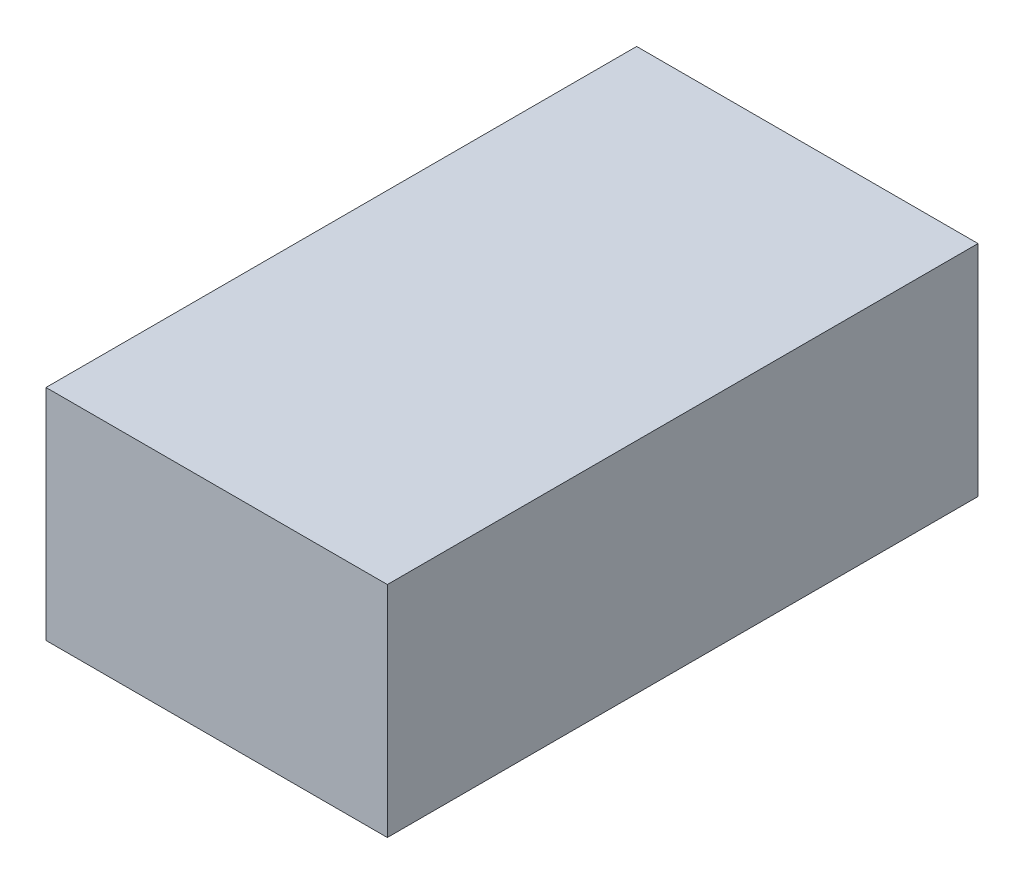
ISO-10303-21;
HEADER;
FILE_DESCRIPTION(('STEP AP214'),'2;1');
FILE_NAME('part.step','',(''),(''),'','','');
FILE_SCHEMA(('AUTOMOTIVE_DESIGN { 1 0 10303 214 1 1 1 1 }'));
ENDSEC;
DATA;
#1=APPLICATION_CONTEXT('core data for automotive mechanical design processes');
#2=APPLICATION_PROTOCOL_DEFINITION('international standard','automotive_design',2000,#1);
#3=PRODUCT_CONTEXT('',#1,'mechanical');
#4=PRODUCT('Part','Part','',(#3));
#5=PRODUCT_RELATED_PRODUCT_CATEGORY('part','',(#4));
#6=PRODUCT_DEFINITION_FORMATION('','',#4);
#7=PRODUCT_DEFINITION_CONTEXT('part definition',#1,'design');
#8=PRODUCT_DEFINITION('design','',#6,#7);
#9=PRODUCT_DEFINITION_SHAPE('','',#8);
#10=(LENGTH_UNIT() NAMED_UNIT(*) SI_UNIT(.MILLI.,.METRE.));
#11=(NAMED_UNIT(*) PLANE_ANGLE_UNIT() SI_UNIT($,.RADIAN.));
#12=(NAMED_UNIT(*) SI_UNIT($,.STERADIAN.) SOLID_ANGLE_UNIT());
#13=UNCERTAINTY_MEASURE_WITH_UNIT(LENGTH_MEASURE(1.E-05),#10,'distance_accuracy_value','');
#14=(GEOMETRIC_REPRESENTATION_CONTEXT(3) GLOBAL_UNCERTAINTY_ASSIGNED_CONTEXT((#13)) GLOBAL_UNIT_ASSIGNED_CONTEXT((#10,
#11,#12)) REPRESENTATION_CONTEXT('',''));
#15=CARTESIAN_POINT('',(0.,0.,0.));
#16=DIRECTION('',(0.,0.,1.));
#17=DIRECTION('',(1.,0.,0.));
#18=AXIS2_PLACEMENT_3D('',#15,#16,#17);
#19=CARTESIAN_POINT('',(-89.8732743262237,25.4,-29.7379213247545));
#20=DIRECTION('',(1.,0.,0.));
#21=DIRECTION('',(0.,0.,-1.));
#22=AXIS2_PLACEMENT_3D('',#19,#20,#21);
#23=PLANE('',#22);
#24=DIRECTION('',(0.,0.,1.));
#25=VECTOR('',#24,1.);
#26=CARTESIAN_POINT('',(-89.8732743262237,0.,-29.7379213247545));
#27=LINE('',#26,#25);
#28=CARTESIAN_POINT('',(-89.8732743262237,0.,-29.7379213247545));
#29=VERTEX_POINT('',#28);
#30=CARTESIAN_POINT('',(-89.8732743262237,0.,38.731244306031));
#31=VERTEX_POINT('',#30);
#32=EDGE_CURVE('E96',#29,#31,#27,.T.);
#33=ORIENTED_EDGE('',*,*,#32,.T.);
#34=DIRECTION('',(0.,-1.,0.));
#35=VECTOR('',#34,1.);
#36=CARTESIAN_POINT('',(-89.8732743262237,25.4,38.731244306031));
#37=LINE('',#36,#35);
#38=CARTESIAN_POINT('',(-89.8732743262237,25.4,38.731244306031));
#39=VERTEX_POINT('',#38);
#40=EDGE_CURVE('E11',#39,#31,#37,.T.);
#41=ORIENTED_EDGE('',*,*,#40,.F.);
#42=DIRECTION('',(0.,0.,1.));
#43=VECTOR('',#42,1.);
#44=CARTESIAN_POINT('',(-89.8732743262237,25.4,-29.7379213247545));
#45=LINE('',#44,#43);
#46=CARTESIAN_POINT('',(-89.8732743262237,25.4,-29.7379213247545));
#47=VERTEX_POINT('',#46);
#48=EDGE_CURVE('E84',#47,#39,#45,.T.);
#49=ORIENTED_EDGE('',*,*,#48,.F.);
#50=DIRECTION('',(0.,-1.,0.));
#51=VECTOR('',#50,1.);
#52=CARTESIAN_POINT('',(-89.8732743262237,25.4,-29.7379213247545));
#53=LINE('',#52,#51);
#54=EDGE_CURVE('E92',#47,#29,#53,.T.);
#55=ORIENTED_EDGE('',*,*,#54,.T.);
#56=EDGE_LOOP('',(#33,#41,#49,#55));
#57=FACE_BOUND('',#56,.T.);
#58=ADVANCED_FACE('F33',(#57),#23,.F.);
#59=CARTESIAN_POINT('',(-89.8732743262237,25.4,38.731244306031));
#60=DIRECTION('',(0.,0.,-1.));
#61=DIRECTION('',(-1.,0.,0.));
#62=AXIS2_PLACEMENT_3D('',#59,#60,#61);
#63=PLANE('',#62);
#64=DIRECTION('',(1.,0.,0.));
#65=VECTOR('',#64,1.);
#66=CARTESIAN_POINT('',(-89.8732743262237,0.,38.731244306031));
#67=LINE('',#66,#65);
#68=CARTESIAN_POINT('',(-50.3026532086069,0.,38.731244306031));
#69=VERTEX_POINT('',#68);
#70=EDGE_CURVE('E88',#31,#69,#67,.T.);
#71=ORIENTED_EDGE('',*,*,#70,.T.);
#72=DIRECTION('',(0.,-1.,0.));
#73=VECTOR('',#72,1.);
#74=CARTESIAN_POINT('',(-50.3026532086069,25.4,38.731244306031));
#75=LINE('',#74,#73);
#76=CARTESIAN_POINT('',(-50.3026532086069,25.4,38.731244306031));
#77=VERTEX_POINT('',#76);
#78=EDGE_CURVE('E41',#77,#69,#75,.T.);
#79=ORIENTED_EDGE('',*,*,#78,.F.);
#80=DIRECTION('',(1.,0.,0.));
#81=VECTOR('',#80,1.);
#82=CARTESIAN_POINT('',(-89.8732743262237,25.4,38.731244306031));
#83=LINE('',#82,#81);
#84=EDGE_CURVE('E79',#39,#77,#83,.T.);
#85=ORIENTED_EDGE('',*,*,#84,.F.);
#86=ORIENTED_EDGE('',*,*,#40,.T.);
#87=EDGE_LOOP('',(#71,#79,#85,#86));
#88=FACE_BOUND('',#87,.T.);
#89=ADVANCED_FACE('F87',(#88),#63,.F.);
#90=CARTESIAN_POINT('',(-50.3026532086069,25.4,-29.7379213247545));
#91=DIRECTION('',(-1.,0.,0.));
#92=DIRECTION('',(0.,0.,1.));
#93=AXIS2_PLACEMENT_3D('',#90,#91,#92);
#94=PLANE('',#93);
#95=DIRECTION('',(0.,0.,-1.));
#96=VECTOR('',#95,1.);
#97=CARTESIAN_POINT('',(-50.3026532086069,0.,-29.7379213247545));
#98=LINE('',#97,#96);
#99=CARTESIAN_POINT('',(-50.3026532086069,0.,-29.7379213247545));
#100=VERTEX_POINT('',#99);
#101=EDGE_CURVE('E66',#69,#100,#98,.T.);
#102=ORIENTED_EDGE('',*,*,#101,.T.);
#103=DIRECTION('',(0.,-1.,0.));
#104=VECTOR('',#103,1.);
#105=CARTESIAN_POINT('',(-50.3026532086069,25.4,-29.7379213247545));
#106=LINE('',#105,#104);
#107=CARTESIAN_POINT('',(-50.3026532086069,25.4,-29.7379213247545));
#108=VERTEX_POINT('',#107);
#109=EDGE_CURVE('E89',#108,#100,#106,.T.);
#110=ORIENTED_EDGE('',*,*,#109,.F.);
#111=DIRECTION('',(0.,0.,-1.));
#112=VECTOR('',#111,1.);
#113=CARTESIAN_POINT('',(-50.3026532086069,25.4,-29.7379213247545));
#114=LINE('',#113,#112);
#115=EDGE_CURVE('E82',#77,#108,#114,.T.);
#116=ORIENTED_EDGE('',*,*,#115,.F.);
#117=ORIENTED_EDGE('',*,*,#78,.T.);
#118=EDGE_LOOP('',(#102,#110,#116,#117));
#119=FACE_BOUND('',#118,.T.);
#120=ADVANCED_FACE('F90',(#119),#94,.F.);
#121=CARTESIAN_POINT('',(-89.8732743262237,25.4,-29.7379213247545));
#122=DIRECTION('',(0.,0.,1.));
#123=DIRECTION('',(1.,0.,0.));
#124=AXIS2_PLACEMENT_3D('',#121,#122,#123);
#125=PLANE('',#124);
#126=DIRECTION('',(-1.,0.,0.));
#127=VECTOR('',#126,1.);
#128=CARTESIAN_POINT('',(-89.8732743262237,0.,-29.7379213247545));
#129=LINE('',#128,#127);
#130=EDGE_CURVE('E72',#100,#29,#129,.T.);
#131=ORIENTED_EDGE('',*,*,#130,.T.);
#132=ORIENTED_EDGE('',*,*,#54,.F.);
#133=DIRECTION('',(-1.,0.,0.));
#134=VECTOR('',#133,1.);
#135=CARTESIAN_POINT('',(-89.8732743262237,25.4,-29.7379213247545));
#136=LINE('',#135,#134);
#137=EDGE_CURVE('E49',#108,#47,#136,.T.);
#138=ORIENTED_EDGE('',*,*,#137,.F.);
#139=ORIENTED_EDGE('',*,*,#109,.T.);
#140=EDGE_LOOP('',(#131,#132,#138,#139));
#141=FACE_BOUND('',#140,.T.);
#142=ADVANCED_FACE('F103',(#141),#125,.F.);
#143=CARTESIAN_POINT('',(0.,25.4,0.));
#144=DIRECTION('',(0.,1.,0.));
#145=DIRECTION('',(0.,0.,1.));
#146=AXIS2_PLACEMENT_3D('',#143,#144,#145);
#147=PLANE('',#146);
#148=ORIENTED_EDGE('',*,*,#48,.T.);
#149=ORIENTED_EDGE('',*,*,#84,.T.);
#150=ORIENTED_EDGE('',*,*,#115,.T.);
#151=ORIENTED_EDGE('',*,*,#137,.T.);
#152=EDGE_LOOP('',(#148,#149,#150,#151));
#153=FACE_BOUND('',#152,.T.);
#154=ADVANCED_FACE('F80',(#153),#147,.T.);
#155=CARTESIAN_POINT('',(0.,0.,0.));
#156=DIRECTION('',(0.,1.,0.));
#157=DIRECTION('',(0.,0.,1.));
#158=AXIS2_PLACEMENT_3D('',#155,#156,#157);
#159=PLANE('',#158);
#160=ORIENTED_EDGE('',*,*,#32,.F.);
#161=ORIENTED_EDGE('',*,*,#130,.F.);
#162=ORIENTED_EDGE('',*,*,#101,.F.);
#163=ORIENTED_EDGE('',*,*,#70,.F.);
#164=EDGE_LOOP('',(#160,#161,#162,#163));
#165=FACE_BOUND('',#164,.T.);
#166=ADVANCED_FACE('F106',(#165),#159,.F.);
#167=CLOSED_SHELL('',(#58,#89,#120,#142,#154,#166));
#168=MANIFOLD_SOLID_BREP('B2',#167);
#169=ADVANCED_BREP_SHAPE_REPRESENTATION('',(#18,#168),#14);
#170=SHAPE_DEFINITION_REPRESENTATION(#9,#169);
ENDSEC;
END-ISO-10303-21;
